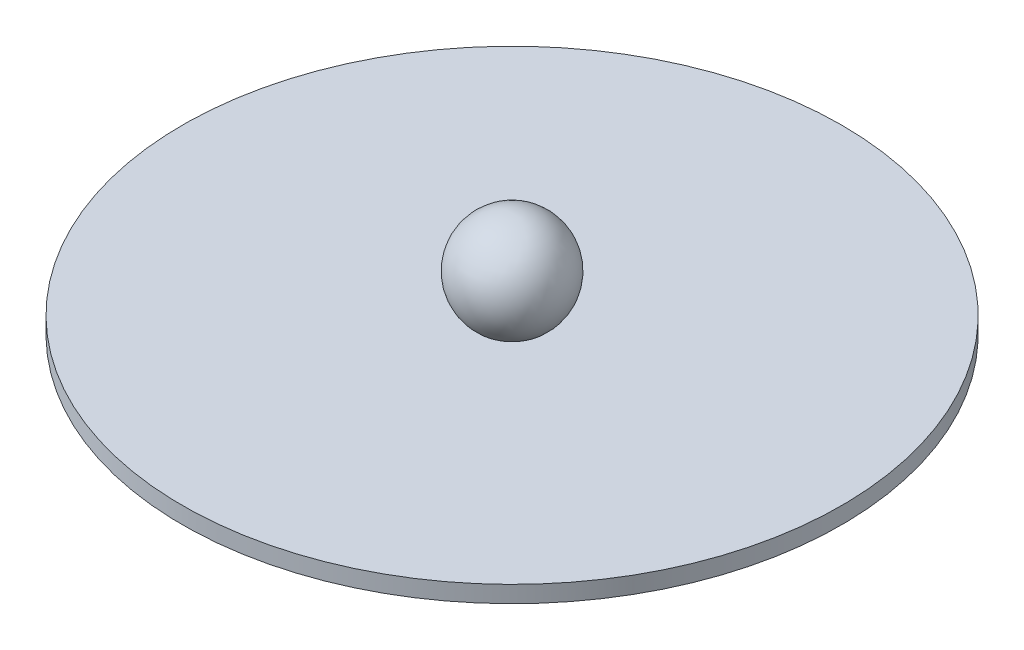
ISO-10303-21;
HEADER;
FILE_DESCRIPTION(('STEP AP214'),'2;1');
FILE_NAME('part.step','',(''),(''),'','','');
FILE_SCHEMA(('AUTOMOTIVE_DESIGN { 1 0 10303 214 1 1 1 1 }'));
ENDSEC;
DATA;
#1=APPLICATION_CONTEXT('core data for automotive mechanical design processes');
#2=APPLICATION_PROTOCOL_DEFINITION('international standard','automotive_design',2000,#1);
#3=PRODUCT_CONTEXT('',#1,'mechanical');
#4=PRODUCT('Part','Part','',(#3));
#5=PRODUCT_RELATED_PRODUCT_CATEGORY('part','',(#4));
#6=PRODUCT_DEFINITION_FORMATION('','',#4);
#7=PRODUCT_DEFINITION_CONTEXT('part definition',#1,'design');
#8=PRODUCT_DEFINITION('design','',#6,#7);
#9=PRODUCT_DEFINITION_SHAPE('','',#8);
#10=(LENGTH_UNIT() NAMED_UNIT(*) SI_UNIT(.MILLI.,.METRE.));
#11=(NAMED_UNIT(*) PLANE_ANGLE_UNIT() SI_UNIT($,.RADIAN.));
#12=(NAMED_UNIT(*) SI_UNIT($,.STERADIAN.) SOLID_ANGLE_UNIT());
#13=UNCERTAINTY_MEASURE_WITH_UNIT(LENGTH_MEASURE(1.E-05),#10,'distance_accuracy_value','');
#14=(GEOMETRIC_REPRESENTATION_CONTEXT(3) GLOBAL_UNCERTAINTY_ASSIGNED_CONTEXT((#13)) GLOBAL_UNIT_ASSIGNED_CONTEXT((#10,
#11,#12)) REPRESENTATION_CONTEXT('',''));
#15=CARTESIAN_POINT('',(0.,0.,0.));
#16=DIRECTION('',(0.,0.,1.));
#17=DIRECTION('',(1.,0.,0.));
#18=AXIS2_PLACEMENT_3D('',#15,#16,#17);
#19=CARTESIAN_POINT('',(0.,12.7,0.));
#20=DIRECTION('',(0.,1.,0.));
#21=DIRECTION('',(0.,0.,1.));
#22=AXIS2_PLACEMENT_3D('',#19,#20,#21);
#23=PLANE('',#22);
#24=CARTESIAN_POINT('',(0.,12.7,0.));
#25=DIRECTION('',(0.,1.,0.));
#26=DIRECTION('',(0.,0.,1.));
#27=AXIS2_PLACEMENT_3D('',#24,#25,#26);
#28=CIRCLE('',#27,12.2794054520389);
#29=CARTESIAN_POINT('',(0.,12.7,12.2794054520389));
#30=VERTEX_POINT('',#29);
#31=EDGE_CURVE('E10',#30,#30,#28,.T.);
#32=ORIENTED_EDGE('',*,*,#31,.F.);
#33=EDGE_LOOP('',(#32));
#34=FACE_BOUND('',#33,.T.);
#35=CARTESIAN_POINT('',(0.,12.7,0.));
#36=DIRECTION('',(0.,-1.,0.));
#37=DIRECTION('',(0.,0.,-1.));
#38=AXIS2_PLACEMENT_3D('',#35,#36,#37);
#39=CIRCLE('',#38,125.095);
#40=CARTESIAN_POINT('',(0.,12.7,-125.095));
#41=VERTEX_POINT('',#40);
#42=EDGE_CURVE('E39',#41,#41,#39,.T.);
#43=ORIENTED_EDGE('',*,*,#42,.F.);
#44=EDGE_LOOP('',(#43));
#45=FACE_BOUND('',#44,.T.);
#46=ADVANCED_FACE('F33',(#34,#45),#23,.T.);
#47=CARTESIAN_POINT('',(0.,0.,0.));
#48=DIRECTION('',(0.,-1.,0.));
#49=DIRECTION('',(0.,0.,-1.));
#50=AXIS2_PLACEMENT_3D('',#47,#48,#49);
#51=CYLINDRICAL_SURFACE('',#50,125.095);
#52=ORIENTED_EDGE('',*,*,#42,.T.);
#53=EDGE_LOOP('',(#52));
#54=FACE_BOUND('',#53,.T.);
#55=CARTESIAN_POINT('',(0.,6.34999999999999,0.));
#56=DIRECTION('',(0.,-1.,0.));
#57=DIRECTION('',(0.,0.,-1.));
#58=AXIS2_PLACEMENT_3D('',#55,#56,#57);
#59=CIRCLE('',#58,125.095);
#60=CARTESIAN_POINT('',(0.,6.34999999999999,-125.095));
#61=VERTEX_POINT('',#60);
#62=EDGE_CURVE('E43',#61,#61,#59,.T.);
#63=ORIENTED_EDGE('',*,*,#62,.F.);
#64=EDGE_LOOP('',(#63));
#65=FACE_BOUND('',#64,.T.);
#66=ADVANCED_FACE('F69',(#54,#65),#51,.T.);
#67=CARTESIAN_POINT('',(125.095,6.34999999999999,0.));
#68=DIRECTION('',(0.,-1.,0.));
#69=DIRECTION('',(0.,0.,-1.));
#70=AXIS2_PLACEMENT_3D('',#67,#68,#69);
#71=PLANE('',#70);
#72=ORIENTED_EDGE('',*,*,#62,.T.);
#73=EDGE_LOOP('',(#72));
#74=FACE_BOUND('',#73,.T.);
#75=CARTESIAN_POINT('',(0.,6.34999999999999,0.));
#76=DIRECTION('',(0.,-1.,0.));
#77=DIRECTION('',(0.,0.,-1.));
#78=AXIS2_PLACEMENT_3D('',#75,#76,#77);
#79=CIRCLE('',#78,120.015);
#80=CARTESIAN_POINT('',(0.,6.34999999999999,-120.015));
#81=VERTEX_POINT('',#80);
#82=EDGE_CURVE('E47',#81,#81,#79,.T.);
#83=ORIENTED_EDGE('',*,*,#82,.F.);
#84=EDGE_LOOP('',(#83));
#85=FACE_BOUND('',#84,.T.);
#86=ADVANCED_FACE('F60',(#74,#85),#71,.T.);
#87=CARTESIAN_POINT('',(0.,0.,0.));
#88=DIRECTION('',(0.,1.,0.));
#89=DIRECTION('',(0.,0.,1.));
#90=AXIS2_PLACEMENT_3D('',#87,#88,#89);
#91=CONICAL_SURFACE('',#90,113.665,0.785398163397444);
#92=ORIENTED_EDGE('',*,*,#82,.T.);
#93=EDGE_LOOP('',(#92));
#94=FACE_BOUND('',#93,.T.);
#95=CARTESIAN_POINT('',(0.,0.,0.));
#96=DIRECTION('',(0.,-1.,0.));
#97=DIRECTION('',(0.,0.,-1.));
#98=AXIS2_PLACEMENT_3D('',#95,#96,#97);
#99=CIRCLE('',#98,113.665);
#100=CARTESIAN_POINT('',(0.,0.,-113.665));
#101=VERTEX_POINT('',#100);
#102=EDGE_CURVE('E52',#101,#101,#99,.T.);
#103=ORIENTED_EDGE('',*,*,#102,.F.);
#104=EDGE_LOOP('',(#103));
#105=FACE_BOUND('',#104,.T.);
#106=ADVANCED_FACE('F58',(#94,#105),#91,.T.);
#107=CARTESIAN_POINT('',(113.665,0.,0.));
#108=DIRECTION('',(0.,-1.,0.));
#109=DIRECTION('',(0.,0.,-1.));
#110=AXIS2_PLACEMENT_3D('',#107,#108,#109);
#111=PLANE('',#110);
#112=ORIENTED_EDGE('',*,*,#102,.T.);
#113=EDGE_LOOP('',(#112));
#114=FACE_BOUND('',#113,.T.);
#115=ADVANCED_FACE('F56',(#114),#111,.T.);
#116=CARTESIAN_POINT('',(0.,27.264295442775,0.));
#117=DIRECTION('',(0.,-1.,0.));
#118=DIRECTION('',(-1.,0.,0.));
#119=AXIS2_PLACEMENT_3D('',#116,#117,#118);
#120=SPHERICAL_SURFACE('',#119,19.05);
#121=ORIENTED_EDGE('',*,*,#31,.T.);
#122=EDGE_LOOP('',(#121));
#123=FACE_BOUND('',#122,.T.);
#124=ADVANCED_FACE('F67',(#123),#120,.T.);
#125=CLOSED_SHELL('',(#46,#66,#86,#106,#115,#124));
#126=MANIFOLD_SOLID_BREP('B2',#125);
#127=ADVANCED_BREP_SHAPE_REPRESENTATION('',(#18,#126),#14);
#128=SHAPE_DEFINITION_REPRESENTATION(#9,#127);
ENDSEC;
END-ISO-10303-21;
